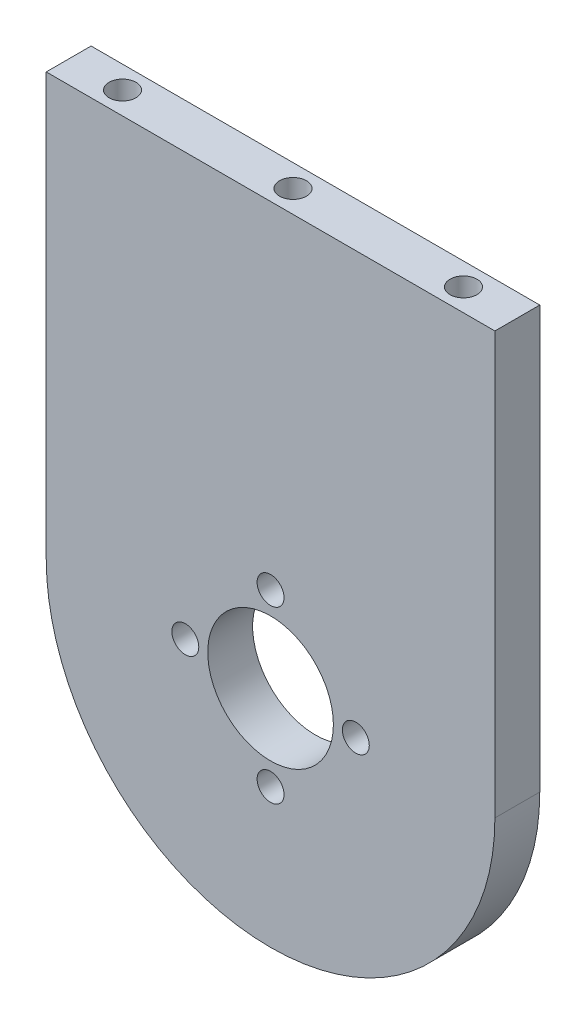
ISO-10303-21;
HEADER;
FILE_DESCRIPTION(('STEP AP214'),'2;1');
FILE_NAME('part.step','',(''),(''),'','','');
FILE_SCHEMA(('AUTOMOTIVE_DESIGN { 1 0 10303 214 1 1 1 1 }'));
ENDSEC;
DATA;
#1=APPLICATION_CONTEXT('core data for automotive mechanical design processes');
#2=APPLICATION_PROTOCOL_DEFINITION('international standard','automotive_design',2000,#1);
#3=PRODUCT_CONTEXT('',#1,'mechanical');
#4=PRODUCT('Part','Part','',(#3));
#5=PRODUCT_RELATED_PRODUCT_CATEGORY('part','',(#4));
#6=PRODUCT_DEFINITION_FORMATION('','',#4);
#7=PRODUCT_DEFINITION_CONTEXT('part definition',#1,'design');
#8=PRODUCT_DEFINITION('design','',#6,#7);
#9=PRODUCT_DEFINITION_SHAPE('','',#8);
#10=(LENGTH_UNIT() NAMED_UNIT(*) SI_UNIT(.MILLI.,.METRE.));
#11=(NAMED_UNIT(*) PLANE_ANGLE_UNIT() SI_UNIT($,.RADIAN.));
#12=(NAMED_UNIT(*) SI_UNIT($,.STERADIAN.) SOLID_ANGLE_UNIT());
#13=UNCERTAINTY_MEASURE_WITH_UNIT(LENGTH_MEASURE(1.E-05),#10,'distance_accuracy_value','');
#14=(GEOMETRIC_REPRESENTATION_CONTEXT(3) GLOBAL_UNCERTAINTY_ASSIGNED_CONTEXT((#13)) GLOBAL_UNIT_ASSIGNED_CONTEXT((#10,
#11,#12)) REPRESENTATION_CONTEXT('',''));
#15=CARTESIAN_POINT('',(0.,0.,0.));
#16=DIRECTION('',(0.,0.,1.));
#17=DIRECTION('',(1.,0.,0.));
#18=AXIS2_PLACEMENT_3D('',#15,#16,#17);
#19=CARTESIAN_POINT('',(0.,47.,5.));
#20=DIRECTION('',(0.,1.,0.));
#21=DIRECTION('',(0.,0.,1.));
#22=AXIS2_PLACEMENT_3D('',#19,#20,#21);
#23=PLANE('',#22);
#24=CARTESIAN_POINT('',(19.,47.,2.5));
#25=DIRECTION('',(0.,1.,0.));
#26=DIRECTION('',(0.,0.,1.));
#27=AXIS2_PLACEMENT_3D('',#24,#25,#26);
#28=CIRCLE('',#27,1.5);
#29=CARTESIAN_POINT('',(19.,47.,4.));
#30=VERTEX_POINT('',#29);
#31=EDGE_CURVE('E330',#30,#30,#28,.T.);
#32=ORIENTED_EDGE('',*,*,#31,.F.);
#33=EDGE_LOOP('',(#32));
#34=FACE_BOUND('',#33,.T.);
#35=CARTESIAN_POINT('',(-19.,47.,2.5));
#36=DIRECTION('',(0.,1.,0.));
#37=DIRECTION('',(0.,0.,1.));
#38=AXIS2_PLACEMENT_3D('',#35,#36,#37);
#39=CIRCLE('',#38,1.5);
#40=CARTESIAN_POINT('',(-19.,47.,4.));
#41=VERTEX_POINT('',#40);
#42=EDGE_CURVE('E316',#41,#41,#39,.T.);
#43=ORIENTED_EDGE('',*,*,#42,.F.);
#44=EDGE_LOOP('',(#43));
#45=FACE_BOUND('',#44,.T.);
#46=CARTESIAN_POINT('',(0.,47.,2.5));
#47=DIRECTION('',(0.,1.,0.));
#48=DIRECTION('',(0.,0.,1.));
#49=AXIS2_PLACEMENT_3D('',#46,#47,#48);
#50=CIRCLE('',#49,1.5);
#51=CARTESIAN_POINT('',(0.,47.,4.));
#52=VERTEX_POINT('',#51);
#53=EDGE_CURVE('E315',#52,#52,#50,.T.);
#54=ORIENTED_EDGE('',*,*,#53,.F.);
#55=EDGE_LOOP('',(#54));
#56=FACE_BOUND('',#55,.T.);
#57=DIRECTION('',(1.,0.,0.));
#58=VECTOR('',#57,1.);
#59=CARTESIAN_POINT('',(0.,47.,5.));
#60=LINE('',#59,#58);
#61=CARTESIAN_POINT('',(-25.,47.,5.));
#62=VERTEX_POINT('',#61);
#63=CARTESIAN_POINT('',(25.,47.,5.));
#64=VERTEX_POINT('',#63);
#65=EDGE_CURVE('E12',#62,#64,#60,.T.);
#66=ORIENTED_EDGE('',*,*,#65,.T.);
#67=DIRECTION('',(0.,0.,1.));
#68=VECTOR('',#67,1.);
#69=CARTESIAN_POINT('',(25.,47.,0.));
#70=LINE('',#69,#68);
#71=CARTESIAN_POINT('',(25.,47.,0.));
#72=VERTEX_POINT('',#71);
#73=EDGE_CURVE('E232',#72,#64,#70,.T.);
#74=ORIENTED_EDGE('',*,*,#73,.F.);
#75=DIRECTION('',(1.,0.,0.));
#76=VECTOR('',#75,1.);
#77=CARTESIAN_POINT('',(0.,47.,0.));
#78=LINE('',#77,#76);
#79=CARTESIAN_POINT('',(-25.,47.,0.));
#80=VERTEX_POINT('',#79);
#81=EDGE_CURVE('E152',#80,#72,#78,.T.);
#82=ORIENTED_EDGE('',*,*,#81,.F.);
#83=DIRECTION('',(0.,0.,1.));
#84=VECTOR('',#83,1.);
#85=CARTESIAN_POINT('',(-25.,47.,0.));
#86=LINE('',#85,#84);
#87=EDGE_CURVE('E166',#80,#62,#86,.T.);
#88=ORIENTED_EDGE('',*,*,#87,.T.);
#89=EDGE_LOOP('',(#66,#74,#82,#88));
#90=FACE_BOUND('',#89,.T.);
#91=ADVANCED_FACE('F148',(#34,#45,#56,#90),#23,.T.);
#92=CARTESIAN_POINT('',(0.,0.,5.));
#93=DIRECTION('',(0.,0.,1.));
#94=DIRECTION('',(1.,0.,0.));
#95=AXIS2_PLACEMENT_3D('',#92,#93,#94);
#96=PLANE('',#95);
#97=CARTESIAN_POINT('',(-9.49999999999915,-8.50722464203463E-13,5.));
#98=DIRECTION('',(0.,0.,1.));
#99=DIRECTION('',(1.,0.,0.));
#100=AXIS2_PLACEMENT_3D('',#97,#98,#99);
#101=CIRCLE('',#100,1.50000000000215);
#102=CARTESIAN_POINT('',(-7.999999999997,-8.50722464203463E-13,5.));
#103=VERTEX_POINT('',#102);
#104=EDGE_CURVE('E356',#103,#103,#101,.T.);
#105=ORIENTED_EDGE('',*,*,#104,.F.);
#106=EDGE_LOOP('',(#105));
#107=FACE_BOUND('',#106,.T.);
#108=CARTESIAN_POINT('',(1.69911809948855E-12,-9.5,5.));
#109=DIRECTION('',(0.,0.,1.));
#110=DIRECTION('',(1.,0.,0.));
#111=AXIS2_PLACEMENT_3D('',#108,#109,#110);
#112=CIRCLE('',#111,1.50000000000185);
#113=CARTESIAN_POINT('',(1.50000000000355,-9.5,5.));
#114=VERTEX_POINT('',#113);
#115=EDGE_CURVE('E218',#114,#114,#112,.T.);
#116=ORIENTED_EDGE('',*,*,#115,.F.);
#117=EDGE_LOOP('',(#116));
#118=FACE_BOUND('',#117,.T.);
#119=CARTESIAN_POINT('',(0.,9.5,5.));
#120=DIRECTION('',(0.,0.,1.));
#121=DIRECTION('',(1.,0.,0.));
#122=AXIS2_PLACEMENT_3D('',#119,#120,#121);
#123=CIRCLE('',#122,1.50000000000181);
#124=CARTESIAN_POINT('',(1.50000000000181,9.5,5.));
#125=VERTEX_POINT('',#124);
#126=EDGE_CURVE('E342',#125,#125,#123,.T.);
#127=ORIENTED_EDGE('',*,*,#126,.F.);
#128=EDGE_LOOP('',(#127));
#129=FACE_BOUND('',#128,.T.);
#130=CARTESIAN_POINT('',(9.50000000000085,8.49559049744273E-13,5.));
#131=DIRECTION('',(0.,0.,1.));
#132=DIRECTION('',(1.,0.,0.));
#133=AXIS2_PLACEMENT_3D('',#130,#131,#132);
#134=CIRCLE('',#133,1.50000000000183);
#135=CARTESIAN_POINT('',(11.0000000000027,8.49559049744273E-13,5.));
#136=VERTEX_POINT('',#135);
#137=EDGE_CURVE('E336',#136,#136,#134,.T.);
#138=ORIENTED_EDGE('',*,*,#137,.F.);
#139=EDGE_LOOP('',(#138));
#140=FACE_BOUND('',#139,.T.);
#141=CARTESIAN_POINT('',(0.,0.,5.));
#142=DIRECTION('',(0.,0.,1.));
#143=DIRECTION('',(1.,0.,0.));
#144=AXIS2_PLACEMENT_3D('',#141,#142,#143);
#145=CIRCLE('',#144,7.);
#146=CARTESIAN_POINT('',(7.,0.,5.));
#147=VERTEX_POINT('',#146);
#148=EDGE_CURVE('E158',#147,#147,#145,.T.);
#149=ORIENTED_EDGE('',*,*,#148,.F.);
#150=EDGE_LOOP('',(#149));
#151=FACE_BOUND('',#150,.T.);
#152=CARTESIAN_POINT('',(0.,0.,5.));
#153=DIRECTION('',(0.,0.,1.));
#154=DIRECTION('',(1.,0.,0.));
#155=AXIS2_PLACEMENT_3D('',#152,#153,#154);
#156=CIRCLE('',#155,25.);
#157=CARTESIAN_POINT('',(-25.,0.,5.));
#158=VERTEX_POINT('',#157);
#159=CARTESIAN_POINT('',(25.,0.,5.));
#160=VERTEX_POINT('',#159);
#161=EDGE_CURVE('E198',#158,#160,#156,.T.);
#162=ORIENTED_EDGE('',*,*,#161,.T.);
#163=DIRECTION('',(0.,1.,0.));
#164=VECTOR('',#163,1.);
#165=CARTESIAN_POINT('',(25.,0.,5.));
#166=LINE('',#165,#164);
#167=EDGE_CURVE('E193',#160,#64,#166,.T.);
#168=ORIENTED_EDGE('',*,*,#167,.T.);
#169=ORIENTED_EDGE('',*,*,#65,.F.);
#170=DIRECTION('',(0.,1.,0.));
#171=VECTOR('',#170,1.);
#172=CARTESIAN_POINT('',(-25.,0.,5.));
#173=LINE('',#172,#171);
#174=EDGE_CURVE('E215',#158,#62,#173,.T.);
#175=ORIENTED_EDGE('',*,*,#174,.F.);
#176=EDGE_LOOP('',(#162,#168,#169,#175));
#177=FACE_BOUND('',#176,.T.);
#178=ADVANCED_FACE('F249',(#107,#118,#129,#140,#151,#177),#96,.T.);
#179=CARTESIAN_POINT('',(0.,0.,0.));
#180=DIRECTION('',(0.,0.,1.));
#181=DIRECTION('',(1.,0.,0.));
#182=AXIS2_PLACEMENT_3D('',#179,#180,#181);
#183=PLANE('',#182);
#184=CARTESIAN_POINT('',(-9.49999999999915,-8.50722464203463E-13,0.));
#185=DIRECTION('',(0.,0.,1.));
#186=DIRECTION('',(1.,0.,0.));
#187=AXIS2_PLACEMENT_3D('',#184,#185,#186);
#188=CIRCLE('',#187,1.50000000000215);
#189=CARTESIAN_POINT('',(-7.999999999997,-8.50722464203463E-13,0.));
#190=VERTEX_POINT('',#189);
#191=EDGE_CURVE('E225',#190,#190,#188,.T.);
#192=ORIENTED_EDGE('',*,*,#191,.T.);
#193=EDGE_LOOP('',(#192));
#194=FACE_BOUND('',#193,.T.);
#195=CARTESIAN_POINT('',(1.69911809948855E-12,-9.5,0.));
#196=DIRECTION('',(0.,0.,1.));
#197=DIRECTION('',(1.,0.,0.));
#198=AXIS2_PLACEMENT_3D('',#195,#196,#197);
#199=CIRCLE('',#198,1.50000000000185);
#200=CARTESIAN_POINT('',(1.50000000000355,-9.5,0.));
#201=VERTEX_POINT('',#200);
#202=EDGE_CURVE('E359',#201,#201,#199,.T.);
#203=ORIENTED_EDGE('',*,*,#202,.T.);
#204=EDGE_LOOP('',(#203));
#205=FACE_BOUND('',#204,.T.);
#206=CARTESIAN_POINT('',(0.,9.5,0.));
#207=DIRECTION('',(0.,0.,1.));
#208=DIRECTION('',(1.,0.,0.));
#209=AXIS2_PLACEMENT_3D('',#206,#207,#208);
#210=CIRCLE('',#209,1.50000000000181);
#211=CARTESIAN_POINT('',(1.50000000000181,9.5,0.));
#212=VERTEX_POINT('',#211);
#213=EDGE_CURVE('E338',#212,#212,#210,.T.);
#214=ORIENTED_EDGE('',*,*,#213,.T.);
#215=EDGE_LOOP('',(#214));
#216=FACE_BOUND('',#215,.T.);
#217=CARTESIAN_POINT('',(9.50000000000085,8.49559049744273E-13,0.));
#218=DIRECTION('',(0.,0.,1.));
#219=DIRECTION('',(1.,0.,0.));
#220=AXIS2_PLACEMENT_3D('',#217,#218,#219);
#221=CIRCLE('',#220,1.50000000000183);
#222=CARTESIAN_POINT('',(11.0000000000027,8.49559049744273E-13,0.));
#223=VERTEX_POINT('',#222);
#224=EDGE_CURVE('E346',#223,#223,#221,.T.);
#225=ORIENTED_EDGE('',*,*,#224,.T.);
#226=EDGE_LOOP('',(#225));
#227=FACE_BOUND('',#226,.T.);
#228=CARTESIAN_POINT('',(0.,0.,0.));
#229=DIRECTION('',(0.,0.,1.));
#230=DIRECTION('',(1.,0.,0.));
#231=AXIS2_PLACEMENT_3D('',#228,#229,#230);
#232=CIRCLE('',#231,7.);
#233=CARTESIAN_POINT('',(7.,0.,0.));
#234=VERTEX_POINT('',#233);
#235=EDGE_CURVE('E231',#234,#234,#232,.T.);
#236=ORIENTED_EDGE('',*,*,#235,.T.);
#237=EDGE_LOOP('',(#236));
#238=FACE_BOUND('',#237,.T.);
#239=DIRECTION('',(0.,1.,0.));
#240=VECTOR('',#239,1.);
#241=CARTESIAN_POINT('',(25.,0.,0.));
#242=LINE('',#241,#240);
#243=CARTESIAN_POINT('',(25.,0.,0.));
#244=VERTEX_POINT('',#243);
#245=EDGE_CURVE('E201',#244,#72,#242,.T.);
#246=ORIENTED_EDGE('',*,*,#245,.F.);
#247=CARTESIAN_POINT('',(0.,0.,0.));
#248=DIRECTION('',(0.,0.,1.));
#249=DIRECTION('',(1.,0.,0.));
#250=AXIS2_PLACEMENT_3D('',#247,#248,#249);
#251=CIRCLE('',#250,25.);
#252=CARTESIAN_POINT('',(-25.,0.,0.));
#253=VERTEX_POINT('',#252);
#254=EDGE_CURVE('E175',#253,#244,#251,.T.);
#255=ORIENTED_EDGE('',*,*,#254,.F.);
#256=DIRECTION('',(0.,1.,0.));
#257=VECTOR('',#256,1.);
#258=CARTESIAN_POINT('',(-25.,0.,0.));
#259=LINE('',#258,#257);
#260=EDGE_CURVE('E203',#253,#80,#259,.T.);
#261=ORIENTED_EDGE('',*,*,#260,.T.);
#262=ORIENTED_EDGE('',*,*,#81,.T.);
#263=EDGE_LOOP('',(#246,#255,#261,#262));
#264=FACE_BOUND('',#263,.T.);
#265=ADVANCED_FACE('F211',(#194,#205,#216,#227,#238,#264),#183,.F.);
#266=CARTESIAN_POINT('',(0.,0.,5.));
#267=DIRECTION('',(0.,0.,-1.));
#268=DIRECTION('',(-1.,0.,0.));
#269=AXIS2_PLACEMENT_3D('',#266,#267,#268);
#270=CYLINDRICAL_SURFACE('',#269,7.);
#271=ORIENTED_EDGE('',*,*,#148,.T.);
#272=EDGE_LOOP('',(#271));
#273=FACE_BOUND('',#272,.T.);
#274=ORIENTED_EDGE('',*,*,#235,.F.);
#275=EDGE_LOOP('',(#274));
#276=FACE_BOUND('',#275,.T.);
#277=ADVANCED_FACE('F150',(#273,#276),#270,.F.);
#278=CARTESIAN_POINT('',(0.,0.,0.));
#279=DIRECTION('',(0.,0.,1.));
#280=DIRECTION('',(1.,0.,0.));
#281=AXIS2_PLACEMENT_3D('',#278,#279,#280);
#282=CYLINDRICAL_SURFACE('',#281,25.);
#283=ORIENTED_EDGE('',*,*,#161,.F.);
#284=DIRECTION('',(0.,0.,1.));
#285=VECTOR('',#284,1.);
#286=CARTESIAN_POINT('',(-25.,0.,0.));
#287=LINE('',#286,#285);
#288=EDGE_CURVE('E195',#253,#158,#287,.T.);
#289=ORIENTED_EDGE('',*,*,#288,.F.);
#290=ORIENTED_EDGE('',*,*,#254,.T.);
#291=DIRECTION('',(0.,0.,1.));
#292=VECTOR('',#291,1.);
#293=CARTESIAN_POINT('',(25.,0.,0.));
#294=LINE('',#293,#292);
#295=EDGE_CURVE('E228',#244,#160,#294,.T.);
#296=ORIENTED_EDGE('',*,*,#295,.T.);
#297=EDGE_LOOP('',(#283,#289,#290,#296));
#298=FACE_BOUND('',#297,.T.);
#299=ADVANCED_FACE('F196',(#298),#282,.T.);
#300=CARTESIAN_POINT('',(25.,0.,0.));
#301=DIRECTION('',(1.,0.,0.));
#302=DIRECTION('',(0.,0.,-1.));
#303=AXIS2_PLACEMENT_3D('',#300,#301,#302);
#304=PLANE('',#303);
#305=ORIENTED_EDGE('',*,*,#167,.F.);
#306=ORIENTED_EDGE('',*,*,#295,.F.);
#307=ORIENTED_EDGE('',*,*,#245,.T.);
#308=ORIENTED_EDGE('',*,*,#73,.T.);
#309=EDGE_LOOP('',(#305,#306,#307,#308));
#310=FACE_BOUND('',#309,.T.);
#311=ADVANCED_FACE('F247',(#310),#304,.T.);
#312=CARTESIAN_POINT('',(-25.,0.,0.));
#313=DIRECTION('',(1.,0.,0.));
#314=DIRECTION('',(0.,0.,-1.));
#315=AXIS2_PLACEMENT_3D('',#312,#313,#314);
#316=PLANE('',#315);
#317=ORIENTED_EDGE('',*,*,#174,.T.);
#318=ORIENTED_EDGE('',*,*,#87,.F.);
#319=ORIENTED_EDGE('',*,*,#260,.F.);
#320=ORIENTED_EDGE('',*,*,#288,.T.);
#321=EDGE_LOOP('',(#317,#318,#319,#320));
#322=FACE_BOUND('',#321,.T.);
#323=ADVANCED_FACE('F204',(#322),#316,.F.);
#324=CARTESIAN_POINT('',(9.50000000000085,8.49559049744273E-13,0.));
#325=DIRECTION('',(0.,0.,1.));
#326=DIRECTION('',(1.,0.,0.));
#327=AXIS2_PLACEMENT_3D('',#324,#325,#326);
#328=CYLINDRICAL_SURFACE('',#327,1.50000000000183);
#329=ORIENTED_EDGE('',*,*,#224,.F.);
#330=EDGE_LOOP('',(#329));
#331=FACE_BOUND('',#330,.T.);
#332=ORIENTED_EDGE('',*,*,#137,.T.);
#333=EDGE_LOOP('',(#332));
#334=FACE_BOUND('',#333,.T.);
#335=ADVANCED_FACE('F268',(#331,#334),#328,.F.);
#336=CARTESIAN_POINT('',(0.,9.5,0.));
#337=DIRECTION('',(0.,0.,1.));
#338=DIRECTION('',(1.,0.,0.));
#339=AXIS2_PLACEMENT_3D('',#336,#337,#338);
#340=CYLINDRICAL_SURFACE('',#339,1.50000000000181);
#341=ORIENTED_EDGE('',*,*,#213,.F.);
#342=EDGE_LOOP('',(#341));
#343=FACE_BOUND('',#342,.T.);
#344=ORIENTED_EDGE('',*,*,#126,.T.);
#345=EDGE_LOOP('',(#344));
#346=FACE_BOUND('',#345,.T.);
#347=ADVANCED_FACE('F275',(#343,#346),#340,.F.);
#348=CARTESIAN_POINT('',(1.69911809948855E-12,-9.5,0.));
#349=DIRECTION('',(0.,0.,1.));
#350=DIRECTION('',(1.,0.,0.));
#351=AXIS2_PLACEMENT_3D('',#348,#349,#350);
#352=CYLINDRICAL_SURFACE('',#351,1.50000000000185);
#353=ORIENTED_EDGE('',*,*,#202,.F.);
#354=EDGE_LOOP('',(#353));
#355=FACE_BOUND('',#354,.T.);
#356=ORIENTED_EDGE('',*,*,#115,.T.);
#357=EDGE_LOOP('',(#356));
#358=FACE_BOUND('',#357,.T.);
#359=ADVANCED_FACE('F271',(#355,#358),#352,.F.);
#360=CARTESIAN_POINT('',(-9.49999999999915,-8.50722464203463E-13,0.));
#361=DIRECTION('',(0.,0.,1.));
#362=DIRECTION('',(1.,0.,0.));
#363=AXIS2_PLACEMENT_3D('',#360,#361,#362);
#364=CYLINDRICAL_SURFACE('',#363,1.50000000000215);
#365=ORIENTED_EDGE('',*,*,#191,.F.);
#366=EDGE_LOOP('',(#365));
#367=FACE_BOUND('',#366,.T.);
#368=ORIENTED_EDGE('',*,*,#104,.T.);
#369=EDGE_LOOP('',(#368));
#370=FACE_BOUND('',#369,.T.);
#371=ADVANCED_FACE('F274',(#367,#370),#364,.F.);
#372=CARTESIAN_POINT('',(0.,37.,2.5));
#373=DIRECTION('',(0.,1.,0.));
#374=DIRECTION('',(0.,0.,1.));
#375=AXIS2_PLACEMENT_3D('',#372,#373,#374);
#376=CYLINDRICAL_SURFACE('',#375,1.5);
#377=CARTESIAN_POINT('',(0.,37.,2.5));
#378=DIRECTION('',(0.,1.,0.));
#379=DIRECTION('',(0.,0.,1.));
#380=AXIS2_PLACEMENT_3D('',#377,#378,#379);
#381=CIRCLE('',#380,1.5);
#382=CARTESIAN_POINT('',(0.,37.,4.));
#383=VERTEX_POINT('',#382);
#384=EDGE_CURVE('E321',#383,#383,#381,.T.);
#385=ORIENTED_EDGE('',*,*,#384,.F.);
#386=EDGE_LOOP('',(#385));
#387=FACE_BOUND('',#386,.T.);
#388=ORIENTED_EDGE('',*,*,#53,.T.);
#389=EDGE_LOOP('',(#388));
#390=FACE_BOUND('',#389,.T.);
#391=ADVANCED_FACE('F279',(#387,#390),#376,.F.);
#392=CARTESIAN_POINT('',(0.,37.,2.5));
#393=DIRECTION('',(0.,1.,0.));
#394=DIRECTION('',(0.,0.,1.));
#395=AXIS2_PLACEMENT_3D('',#392,#393,#394);
#396=PLANE('',#395);
#397=ORIENTED_EDGE('',*,*,#384,.T.);
#398=EDGE_LOOP('',(#397));
#399=FACE_BOUND('',#398,.T.);
#400=ADVANCED_FACE('F289',(#399),#396,.T.);
#401=CARTESIAN_POINT('',(-19.,37.,2.5));
#402=DIRECTION('',(0.,1.,0.));
#403=DIRECTION('',(0.,0.,1.));
#404=AXIS2_PLACEMENT_3D('',#401,#402,#403);
#405=CYLINDRICAL_SURFACE('',#404,1.5);
#406=CARTESIAN_POINT('',(-19.,37.,2.5));
#407=DIRECTION('',(0.,1.,0.));
#408=DIRECTION('',(0.,0.,1.));
#409=AXIS2_PLACEMENT_3D('',#406,#407,#408);
#410=CIRCLE('',#409,1.5);
#411=CARTESIAN_POINT('',(-19.,37.,4.));
#412=VERTEX_POINT('',#411);
#413=EDGE_CURVE('E313',#412,#412,#410,.T.);
#414=ORIENTED_EDGE('',*,*,#413,.F.);
#415=EDGE_LOOP('',(#414));
#416=FACE_BOUND('',#415,.T.);
#417=ORIENTED_EDGE('',*,*,#42,.T.);
#418=EDGE_LOOP('',(#417));
#419=FACE_BOUND('',#418,.T.);
#420=ADVANCED_FACE('F293',(#416,#419),#405,.F.);
#421=CARTESIAN_POINT('',(-19.,37.,2.5));
#422=DIRECTION('',(0.,1.,0.));
#423=DIRECTION('',(0.,0.,1.));
#424=AXIS2_PLACEMENT_3D('',#421,#422,#423);
#425=PLANE('',#424);
#426=ORIENTED_EDGE('',*,*,#413,.T.);
#427=EDGE_LOOP('',(#426));
#428=FACE_BOUND('',#427,.T.);
#429=ADVANCED_FACE('F299',(#428),#425,.T.);
#430=CARTESIAN_POINT('',(19.,37.,2.5));
#431=DIRECTION('',(0.,1.,0.));
#432=DIRECTION('',(0.,0.,1.));
#433=AXIS2_PLACEMENT_3D('',#430,#431,#432);
#434=CYLINDRICAL_SURFACE('',#433,1.5);
#435=CARTESIAN_POINT('',(19.,37.,2.5));
#436=DIRECTION('',(0.,1.,0.));
#437=DIRECTION('',(0.,0.,1.));
#438=AXIS2_PLACEMENT_3D('',#435,#436,#437);
#439=CIRCLE('',#438,1.5);
#440=CARTESIAN_POINT('',(19.,37.,4.));
#441=VERTEX_POINT('',#440);
#442=EDGE_CURVE('E324',#441,#441,#439,.T.);
#443=ORIENTED_EDGE('',*,*,#442,.F.);
#444=EDGE_LOOP('',(#443));
#445=FACE_BOUND('',#444,.T.);
#446=ORIENTED_EDGE('',*,*,#31,.T.);
#447=EDGE_LOOP('',(#446));
#448=FACE_BOUND('',#447,.T.);
#449=ADVANCED_FACE('F295',(#445,#448),#434,.F.);
#450=CARTESIAN_POINT('',(19.,37.,2.5));
#451=DIRECTION('',(0.,1.,0.));
#452=DIRECTION('',(0.,0.,1.));
#453=AXIS2_PLACEMENT_3D('',#450,#451,#452);
#454=PLANE('',#453);
#455=ORIENTED_EDGE('',*,*,#442,.T.);
#456=EDGE_LOOP('',(#455));
#457=FACE_BOUND('',#456,.T.);
#458=ADVANCED_FACE('F298',(#457),#454,.T.);
#459=CLOSED_SHELL('',(#91,#178,#265,#277,#299,#311,#323,#335,#347,#359,#371,#391,#400,#420,#429,
#449,#458));
#460=MANIFOLD_SOLID_BREP('B2',#459);
#461=ADVANCED_BREP_SHAPE_REPRESENTATION('',(#18,#460),#14);
#462=SHAPE_DEFINITION_REPRESENTATION(#9,#461);
ENDSEC;
END-ISO-10303-21;
